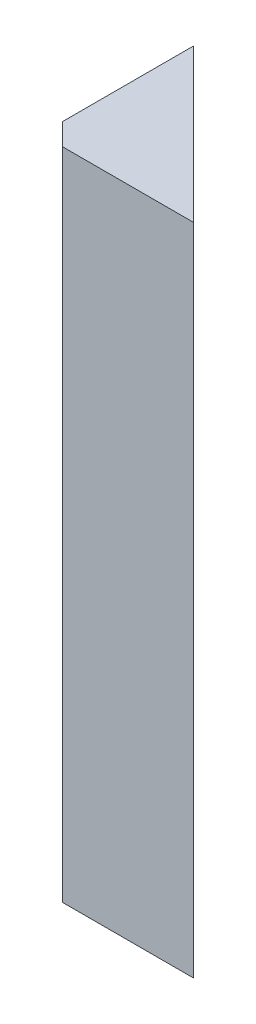
ISO-10303-21;
HEADER;
FILE_DESCRIPTION(('STEP AP214'),'2;1');
FILE_NAME('part.step','',(''),(''),'','','');
FILE_SCHEMA(('AUTOMOTIVE_DESIGN { 1 0 10303 214 1 1 1 1 }'));
ENDSEC;
DATA;
#1=APPLICATION_CONTEXT('core data for automotive mechanical design processes');
#2=APPLICATION_PROTOCOL_DEFINITION('international standard','automotive_design',2000,#1);
#3=PRODUCT_CONTEXT('',#1,'mechanical');
#4=PRODUCT('Part','Part','',(#3));
#5=PRODUCT_RELATED_PRODUCT_CATEGORY('part','',(#4));
#6=PRODUCT_DEFINITION_FORMATION('','',#4);
#7=PRODUCT_DEFINITION_CONTEXT('part definition',#1,'design');
#8=PRODUCT_DEFINITION('design','',#6,#7);
#9=PRODUCT_DEFINITION_SHAPE('','',#8);
#10=(LENGTH_UNIT() NAMED_UNIT(*) SI_UNIT(.MILLI.,.METRE.));
#11=(NAMED_UNIT(*) PLANE_ANGLE_UNIT() SI_UNIT($,.RADIAN.));
#12=(NAMED_UNIT(*) SI_UNIT($,.STERADIAN.) SOLID_ANGLE_UNIT());
#13=UNCERTAINTY_MEASURE_WITH_UNIT(LENGTH_MEASURE(1.E-05),#10,'distance_accuracy_value','');
#14=(GEOMETRIC_REPRESENTATION_CONTEXT(3) GLOBAL_UNCERTAINTY_ASSIGNED_CONTEXT((#13)) GLOBAL_UNIT_ASSIGNED_CONTEXT((#10,
#11,#12)) REPRESENTATION_CONTEXT('',''));
#15=CARTESIAN_POINT('',(0.,0.,0.));
#16=DIRECTION('',(0.,0.,1.));
#17=DIRECTION('',(1.,0.,0.));
#18=AXIS2_PLACEMENT_3D('',#15,#16,#17);
#19=CARTESIAN_POINT('',(0.,1.5,0.));
#20=DIRECTION('',(0.707106781186548,0.,-0.707106781186547));
#21=DIRECTION('',(-0.707106781186547,0.,-0.707106781186548));
#22=AXIS2_PLACEMENT_3D('',#19,#20,#21);
#23=PLANE('',#22);
#24=DIRECTION('',(0.707106781186547,0.,0.707106781186548));
#25=VECTOR('',#24,1.);
#26=CARTESIAN_POINT('',(0.,0.,0.));
#27=LINE('',#26,#25);
#28=CARTESIAN_POINT('',(0.,0.,0.));
#29=VERTEX_POINT('',#28);
#30=CARTESIAN_POINT('',(0.0499999999999994,0.,0.0499999999999995));
#31=VERTEX_POINT('',#30);
#32=EDGE_CURVE('E98',#29,#31,#27,.T.);
#33=ORIENTED_EDGE('',*,*,#32,.T.);
#34=DIRECTION('',(0.,-1.,0.));
#35=VECTOR('',#34,1.);
#36=CARTESIAN_POINT('',(0.0499999999999994,1.5,0.0499999999999995));
#37=LINE('',#36,#35);
#38=CARTESIAN_POINT('',(0.0499999999999994,1.5,0.0499999999999995));
#39=VERTEX_POINT('',#38);
#40=EDGE_CURVE('E11',#39,#31,#37,.T.);
#41=ORIENTED_EDGE('',*,*,#40,.F.);
#42=DIRECTION('',(0.707106781186547,0.,0.707106781186548));
#43=VECTOR('',#42,1.);
#44=CARTESIAN_POINT('',(0.,1.5,0.));
#45=LINE('',#44,#43);
#46=CARTESIAN_POINT('',(0.,1.5,0.));
#47=VERTEX_POINT('',#46);
#48=EDGE_CURVE('E86',#47,#39,#45,.T.);
#49=ORIENTED_EDGE('',*,*,#48,.F.);
#50=DIRECTION('',(0.,-1.,0.));
#51=VECTOR('',#50,1.);
#52=CARTESIAN_POINT('',(0.,1.5,0.));
#53=LINE('',#52,#51);
#54=EDGE_CURVE('E94',#47,#29,#53,.T.);
#55=ORIENTED_EDGE('',*,*,#54,.T.);
#56=EDGE_LOOP('',(#33,#41,#49,#55));
#57=FACE_BOUND('',#56,.T.);
#58=ADVANCED_FACE('F35',(#57),#23,.F.);
#59=CARTESIAN_POINT('',(0.0499999999999994,1.5,0.0499999999999995));
#60=DIRECTION('',(0.,0.,-1.));
#61=DIRECTION('',(-1.,0.,0.));
#62=AXIS2_PLACEMENT_3D('',#59,#60,#61);
#63=PLANE('',#62);
#64=DIRECTION('',(1.,0.,0.));
#65=VECTOR('',#64,1.);
#66=CARTESIAN_POINT('',(0.0499999999999994,0.,0.0499999999999995));
#67=LINE('',#66,#65);
#68=CARTESIAN_POINT('',(0.349999999999999,0.,0.0500000000000005));
#69=VERTEX_POINT('',#68);
#70=EDGE_CURVE('E90',#31,#69,#67,.T.);
#71=ORIENTED_EDGE('',*,*,#70,.T.);
#72=DIRECTION('',(0.,-1.,0.));
#73=VECTOR('',#72,1.);
#74=CARTESIAN_POINT('',(0.349999999999999,1.5,0.0500000000000005));
#75=LINE('',#74,#73);
#76=CARTESIAN_POINT('',(0.349999999999999,1.5,0.0500000000000005));
#77=VERTEX_POINT('',#76);
#78=EDGE_CURVE('E43',#77,#69,#75,.T.);
#79=ORIENTED_EDGE('',*,*,#78,.F.);
#80=DIRECTION('',(1.,0.,0.));
#81=VECTOR('',#80,1.);
#82=CARTESIAN_POINT('',(0.0499999999999994,1.5,0.0499999999999995));
#83=LINE('',#82,#81);
#84=EDGE_CURVE('E81',#39,#77,#83,.T.);
#85=ORIENTED_EDGE('',*,*,#84,.F.);
#86=ORIENTED_EDGE('',*,*,#40,.T.);
#87=EDGE_LOOP('',(#71,#79,#85,#86));
#88=FACE_BOUND('',#87,.T.);
#89=ADVANCED_FACE('F89',(#88),#63,.F.);
#90=CARTESIAN_POINT('',(0.,1.5,-0.3));
#91=DIRECTION('',(-0.707106781186549,0.,0.707106781186546));
#92=DIRECTION('',(0.707106781186546,0.,0.707106781186549));
#93=AXIS2_PLACEMENT_3D('',#90,#91,#92);
#94=PLANE('',#93);
#95=DIRECTION('',(-0.707106781186546,0.,-0.707106781186548));
#96=VECTOR('',#95,1.);
#97=CARTESIAN_POINT('',(0.,0.,-0.3));
#98=LINE('',#97,#96);
#99=CARTESIAN_POINT('',(0.,0.,-0.3));
#100=VERTEX_POINT('',#99);
#101=EDGE_CURVE('E68',#69,#100,#98,.T.);
#102=ORIENTED_EDGE('',*,*,#101,.T.);
#103=DIRECTION('',(0.,-1.,0.));
#104=VECTOR('',#103,1.);
#105=CARTESIAN_POINT('',(0.,1.5,-0.3));
#106=LINE('',#105,#104);
#107=CARTESIAN_POINT('',(0.,1.5,-0.3));
#108=VERTEX_POINT('',#107);
#109=EDGE_CURVE('E91',#108,#100,#106,.T.);
#110=ORIENTED_EDGE('',*,*,#109,.F.);
#111=DIRECTION('',(-0.707106781186546,0.,-0.707106781186548));
#112=VECTOR('',#111,1.);
#113=CARTESIAN_POINT('',(0.,1.5,-0.3));
#114=LINE('',#113,#112);
#115=EDGE_CURVE('E84',#77,#108,#114,.T.);
#116=ORIENTED_EDGE('',*,*,#115,.F.);
#117=ORIENTED_EDGE('',*,*,#78,.T.);
#118=EDGE_LOOP('',(#102,#110,#116,#117));
#119=FACE_BOUND('',#118,.T.);
#120=ADVANCED_FACE('F92',(#119),#94,.F.);
#121=CARTESIAN_POINT('',(0.,1.5,0.));
#122=DIRECTION('',(1.,0.,0.));
#123=DIRECTION('',(0.,0.,-1.));
#124=AXIS2_PLACEMENT_3D('',#121,#122,#123);
#125=PLANE('',#124);
#126=DIRECTION('',(0.,0.,1.));
#127=VECTOR('',#126,1.);
#128=CARTESIAN_POINT('',(0.,0.,0.));
#129=LINE('',#128,#127);
#130=EDGE_CURVE('E74',#100,#29,#129,.T.);
#131=ORIENTED_EDGE('',*,*,#130,.T.);
#132=ORIENTED_EDGE('',*,*,#54,.F.);
#133=DIRECTION('',(0.,0.,1.));
#134=VECTOR('',#133,1.);
#135=CARTESIAN_POINT('',(0.,1.5,0.));
#136=LINE('',#135,#134);
#137=EDGE_CURVE('E51',#108,#47,#136,.T.);
#138=ORIENTED_EDGE('',*,*,#137,.F.);
#139=ORIENTED_EDGE('',*,*,#109,.T.);
#140=EDGE_LOOP('',(#131,#132,#138,#139));
#141=FACE_BOUND('',#140,.T.);
#142=ADVANCED_FACE('F105',(#141),#125,.F.);
#143=CARTESIAN_POINT('',(0.,1.5,0.));
#144=DIRECTION('',(0.,1.,0.));
#145=DIRECTION('',(0.,0.,1.));
#146=AXIS2_PLACEMENT_3D('',#143,#144,#145);
#147=PLANE('',#146);
#148=ORIENTED_EDGE('',*,*,#48,.T.);
#149=ORIENTED_EDGE('',*,*,#84,.T.);
#150=ORIENTED_EDGE('',*,*,#115,.T.);
#151=ORIENTED_EDGE('',*,*,#137,.T.);
#152=EDGE_LOOP('',(#148,#149,#150,#151));
#153=FACE_BOUND('',#152,.T.);
#154=ADVANCED_FACE('F82',(#153),#147,.T.);
#155=CARTESIAN_POINT('',(0.,0.,0.));
#156=DIRECTION('',(0.,1.,0.));
#157=DIRECTION('',(0.,0.,1.));
#158=AXIS2_PLACEMENT_3D('',#155,#156,#157);
#159=PLANE('',#158);
#160=ORIENTED_EDGE('',*,*,#32,.F.);
#161=ORIENTED_EDGE('',*,*,#130,.F.);
#162=ORIENTED_EDGE('',*,*,#101,.F.);
#163=ORIENTED_EDGE('',*,*,#70,.F.);
#164=EDGE_LOOP('',(#160,#161,#162,#163));
#165=FACE_BOUND('',#164,.T.);
#166=ADVANCED_FACE('F108',(#165),#159,.F.);
#167=CLOSED_SHELL('',(#58,#89,#120,#142,#154,#166));
#168=MANIFOLD_SOLID_BREP('B2',#167);
#169=ADVANCED_BREP_SHAPE_REPRESENTATION('',(#18,#168),#14);
#170=SHAPE_DEFINITION_REPRESENTATION(#9,#169);
ENDSEC;
END-ISO-10303-21;
